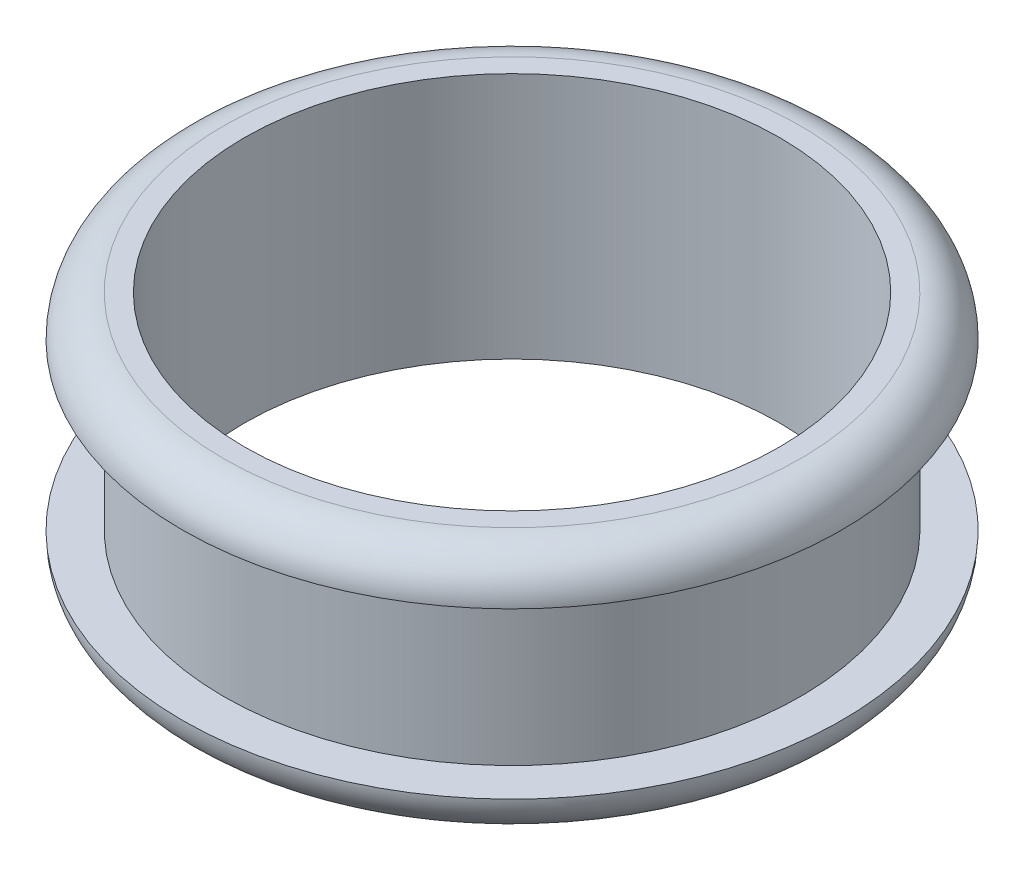
ISO-10303-21;
HEADER;
FILE_DESCRIPTION(('STEP AP214'),'2;1');
FILE_NAME('part.step','',(''),(''),'','','');
FILE_SCHEMA(('AUTOMOTIVE_DESIGN { 1 0 10303 214 1 1 1 1 }'));
ENDSEC;
DATA;
#1=APPLICATION_CONTEXT('core data for automotive mechanical design processes');
#2=APPLICATION_PROTOCOL_DEFINITION('international standard','automotive_design',2000,#1);
#3=PRODUCT_CONTEXT('',#1,'mechanical');
#4=PRODUCT('Part','Part','',(#3));
#5=PRODUCT_RELATED_PRODUCT_CATEGORY('part','',(#4));
#6=PRODUCT_DEFINITION_FORMATION('','',#4);
#7=PRODUCT_DEFINITION_CONTEXT('part definition',#1,'design');
#8=PRODUCT_DEFINITION('design','',#6,#7);
#9=PRODUCT_DEFINITION_SHAPE('','',#8);
#10=(LENGTH_UNIT() NAMED_UNIT(*) SI_UNIT(.MILLI.,.METRE.));
#11=(NAMED_UNIT(*) PLANE_ANGLE_UNIT() SI_UNIT($,.RADIAN.));
#12=(NAMED_UNIT(*) SI_UNIT($,.STERADIAN.) SOLID_ANGLE_UNIT());
#13=UNCERTAINTY_MEASURE_WITH_UNIT(LENGTH_MEASURE(1.E-05),#10,'distance_accuracy_value','');
#14=(GEOMETRIC_REPRESENTATION_CONTEXT(3) GLOBAL_UNCERTAINTY_ASSIGNED_CONTEXT((#13)) GLOBAL_UNIT_ASSIGNED_CONTEXT((#10,
#11,#12)) REPRESENTATION_CONTEXT('',''));
#15=CARTESIAN_POINT('',(0.,0.,0.));
#16=DIRECTION('',(0.,0.,1.));
#17=DIRECTION('',(1.,0.,0.));
#18=AXIS2_PLACEMENT_3D('',#15,#16,#17);
#19=CARTESIAN_POINT('',(0.,1.5,0.));
#20=DIRECTION('',(0.,1.,0.));
#21=DIRECTION('',(0.,0.,1.));
#22=AXIS2_PLACEMENT_3D('',#19,#20,#21);
#23=PLANE('',#22);
#24=CARTESIAN_POINT('',(0.,1.5,0.));
#25=DIRECTION('',(0.,1.,0.));
#26=DIRECTION('',(0.,0.,1.));
#27=AXIS2_PLACEMENT_3D('',#24,#25,#26);
#28=CIRCLE('',#27,3.5);
#29=CARTESIAN_POINT('',(0.,1.5,3.5));
#30=VERTEX_POINT('',#29);
#31=EDGE_CURVE('E10',#30,#30,#28,.T.);
#32=ORIENTED_EDGE('',*,*,#31,.T.);
#33=EDGE_LOOP('',(#32));
#34=FACE_BOUND('',#33,.T.);
#35=CARTESIAN_POINT('',(0.,1.5,0.));
#36=DIRECTION('',(0.,1.,0.));
#37=DIRECTION('',(0.,0.,1.));
#38=AXIS2_PLACEMENT_3D('',#35,#36,#37);
#39=CIRCLE('',#38,3.25);
#40=CARTESIAN_POINT('',(0.,1.5,3.25));
#41=VERTEX_POINT('',#40);
#42=EDGE_CURVE('E51',#41,#41,#39,.T.);
#43=ORIENTED_EDGE('',*,*,#42,.F.);
#44=EDGE_LOOP('',(#43));
#45=FACE_BOUND('',#44,.T.);
#46=ADVANCED_FACE('F36',(#34,#45),#23,.T.);
#47=CARTESIAN_POINT('',(0.,-1.5,0.));
#48=DIRECTION('',(0.,1.,0.));
#49=DIRECTION('',(0.,0.,1.));
#50=AXIS2_PLACEMENT_3D('',#47,#48,#49);
#51=PLANE('',#50);
#52=CARTESIAN_POINT('',(0.,-1.5,0.));
#53=DIRECTION('',(0.,1.,0.));
#54=DIRECTION('',(0.,0.,1.));
#55=AXIS2_PLACEMENT_3D('',#52,#53,#54);
#56=CIRCLE('',#55,3.5);
#57=CARTESIAN_POINT('',(0.,-1.5,3.5));
#58=VERTEX_POINT('',#57);
#59=EDGE_CURVE('E43',#58,#58,#56,.F.);
#60=ORIENTED_EDGE('',*,*,#59,.T.);
#61=EDGE_LOOP('',(#60));
#62=FACE_BOUND('',#61,.T.);
#63=CARTESIAN_POINT('',(0.,-1.5,0.));
#64=DIRECTION('',(0.,1.,0.));
#65=DIRECTION('',(0.,0.,1.));
#66=AXIS2_PLACEMENT_3D('',#63,#64,#65);
#67=CIRCLE('',#66,3.25);
#68=CARTESIAN_POINT('',(0.,-1.5,3.25));
#69=VERTEX_POINT('',#68);
#70=EDGE_CURVE('E47',#69,#69,#67,.T.);
#71=ORIENTED_EDGE('',*,*,#70,.T.);
#72=EDGE_LOOP('',(#71));
#73=FACE_BOUND('',#72,.T.);
#74=ADVANCED_FACE('F98',(#62,#73),#51,.F.);
#75=CARTESIAN_POINT('',(0.,-1.5,0.));
#76=DIRECTION('',(0.,1.,0.));
#77=DIRECTION('',(0.,0.,1.));
#78=AXIS2_PLACEMENT_3D('',#75,#76,#77);
#79=CYLINDRICAL_SURFACE('',#78,3.25);
#80=ORIENTED_EDGE('',*,*,#70,.F.);
#81=EDGE_LOOP('',(#80));
#82=FACE_BOUND('',#81,.T.);
#83=ORIENTED_EDGE('',*,*,#42,.T.);
#84=EDGE_LOOP('',(#83));
#85=FACE_BOUND('',#84,.T.);
#86=ADVANCED_FACE('F87',(#82,#85),#79,.F.);
#87=CARTESIAN_POINT('',(0.,-1.,4.));
#88=DIRECTION('',(0.,-1.,0.));
#89=DIRECTION('',(0.,0.,-1.));
#90=AXIS2_PLACEMENT_3D('',#87,#88,#89);
#91=PLANE('',#90);
#92=CARTESIAN_POINT('',(0.,-1.,0.));
#93=DIRECTION('',(0.,1.,0.));
#94=DIRECTION('',(0.,0.,1.));
#95=AXIS2_PLACEMENT_3D('',#92,#93,#94);
#96=CIRCLE('',#95,3.5);
#97=CARTESIAN_POINT('',(0.,-1.,3.5));
#98=VERTEX_POINT('',#97);
#99=EDGE_CURVE('E59',#98,#98,#96,.T.);
#100=ORIENTED_EDGE('',*,*,#99,.F.);
#101=EDGE_LOOP('',(#100));
#102=FACE_BOUND('',#101,.T.);
#103=CARTESIAN_POINT('',(0.,-1.,0.));
#104=DIRECTION('',(0.,1.,0.));
#105=DIRECTION('',(0.,0.,1.));
#106=AXIS2_PLACEMENT_3D('',#103,#104,#105);
#107=CIRCLE('',#106,4.);
#108=CARTESIAN_POINT('',(0.,-1.,4.));
#109=VERTEX_POINT('',#108);
#110=EDGE_CURVE('E56',#109,#109,#107,.T.);
#111=ORIENTED_EDGE('',*,*,#110,.T.);
#112=EDGE_LOOP('',(#111));
#113=FACE_BOUND('',#112,.T.);
#114=ADVANCED_FACE('F81',(#102,#113),#91,.F.);
#115=CARTESIAN_POINT('',(0.,1.11565940005676,0.));
#116=DIRECTION('',(0.,1.,0.));
#117=DIRECTION('',(0.,0.,1.));
#118=AXIS2_PLACEMENT_3D('',#115,#116,#117);
#119=CYLINDRICAL_SURFACE('',#118,3.5);
#120=CARTESIAN_POINT('',(0.,1.,0.));
#121=DIRECTION('',(0.,1.,0.));
#122=DIRECTION('',(0.,0.,1.));
#123=AXIS2_PLACEMENT_3D('',#120,#121,#122);
#124=CIRCLE('',#123,3.5);
#125=CARTESIAN_POINT('',(0.,1.,3.5));
#126=VERTEX_POINT('',#125);
#127=EDGE_CURVE('E62',#126,#126,#124,.T.);
#128=ORIENTED_EDGE('',*,*,#127,.F.);
#129=EDGE_LOOP('',(#128));
#130=FACE_BOUND('',#129,.T.);
#131=ORIENTED_EDGE('',*,*,#99,.T.);
#132=EDGE_LOOP('',(#131));
#133=FACE_BOUND('',#132,.T.);
#134=ADVANCED_FACE('F75',(#130,#133),#119,.T.);
#135=CARTESIAN_POINT('',(0.,1.,4.));
#136=DIRECTION('',(0.,1.,0.));
#137=DIRECTION('',(0.,0.,1.));
#138=AXIS2_PLACEMENT_3D('',#135,#136,#137);
#139=PLANE('',#138);
#140=CARTESIAN_POINT('',(0.,1.,0.));
#141=DIRECTION('',(0.,1.,0.));
#142=DIRECTION('',(0.,0.,1.));
#143=AXIS2_PLACEMENT_3D('',#140,#141,#142);
#144=CIRCLE('',#143,4.);
#145=CARTESIAN_POINT('',(0.,1.,4.));
#146=VERTEX_POINT('',#145);
#147=EDGE_CURVE('E65',#146,#146,#144,.T.);
#148=ORIENTED_EDGE('',*,*,#147,.F.);
#149=EDGE_LOOP('',(#148));
#150=FACE_BOUND('',#149,.T.);
#151=ORIENTED_EDGE('',*,*,#127,.T.);
#152=EDGE_LOOP('',(#151));
#153=FACE_BOUND('',#152,.T.);
#154=ADVANCED_FACE('F71',(#150,#153),#139,.F.);
#155=CARTESIAN_POINT('',(0.,-1.,0.));
#156=DIRECTION('',(0.,1.,0.));
#157=DIRECTION('',(0.,0.,1.));
#158=AXIS2_PLACEMENT_3D('',#155,#156,#157);
#159=TOROIDAL_SURFACE('',#158,3.5,0.5);
#160=ORIENTED_EDGE('',*,*,#59,.F.);
#161=EDGE_LOOP('',(#160));
#162=FACE_BOUND('',#161,.T.);
#163=ORIENTED_EDGE('',*,*,#110,.F.);
#164=EDGE_LOOP('',(#163));
#165=FACE_BOUND('',#164,.T.);
#166=ADVANCED_FACE('F74',(#162,#165),#159,.T.);
#167=CARTESIAN_POINT('',(0.,1.,0.));
#168=DIRECTION('',(0.,1.,0.));
#169=DIRECTION('',(0.,0.,1.));
#170=AXIS2_PLACEMENT_3D('',#167,#168,#169);
#171=TOROIDAL_SURFACE('',#170,3.5,0.5);
#172=ORIENTED_EDGE('',*,*,#147,.T.);
#173=EDGE_LOOP('',(#172));
#174=FACE_BOUND('',#173,.T.);
#175=ORIENTED_EDGE('',*,*,#31,.F.);
#176=EDGE_LOOP('',(#175));
#177=FACE_BOUND('',#176,.T.);
#178=ADVANCED_FACE('F38',(#174,#177),#171,.T.);
#179=CLOSED_SHELL('',(#46,#74,#86,#114,#134,#154,#166,#178));
#180=MANIFOLD_SOLID_BREP('B2',#179);
#181=ADVANCED_BREP_SHAPE_REPRESENTATION('',(#18,#180),#14);
#182=SHAPE_DEFINITION_REPRESENTATION(#9,#181);
ENDSEC;
END-ISO-10303-21;
